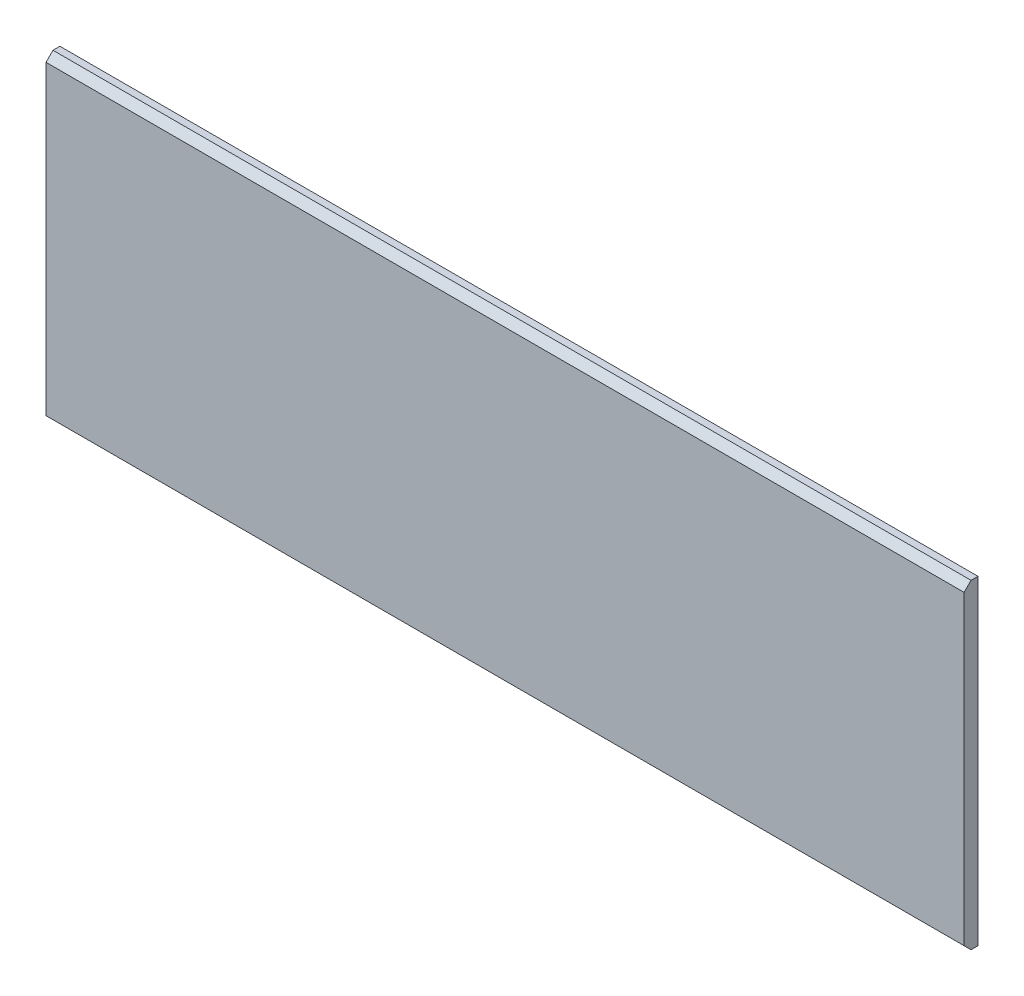
ISO-10303-21;
HEADER;
FILE_DESCRIPTION(('STEP AP214'),'2;1');
FILE_NAME('part.step','',(''),(''),'','','');
FILE_SCHEMA(('AUTOMOTIVE_DESIGN { 1 0 10303 214 1 1 1 1 }'));
ENDSEC;
DATA;
#1=APPLICATION_CONTEXT('core data for automotive mechanical design processes');
#2=APPLICATION_PROTOCOL_DEFINITION('international standard','automotive_design',2000,#1);
#3=PRODUCT_CONTEXT('',#1,'mechanical');
#4=PRODUCT('Part','Part','',(#3));
#5=PRODUCT_RELATED_PRODUCT_CATEGORY('part','',(#4));
#6=PRODUCT_DEFINITION_FORMATION('','',#4);
#7=PRODUCT_DEFINITION_CONTEXT('part definition',#1,'design');
#8=PRODUCT_DEFINITION('design','',#6,#7);
#9=PRODUCT_DEFINITION_SHAPE('','',#8);
#10=(LENGTH_UNIT() NAMED_UNIT(*) SI_UNIT(.MILLI.,.METRE.));
#11=(NAMED_UNIT(*) PLANE_ANGLE_UNIT() SI_UNIT($,.RADIAN.));
#12=(NAMED_UNIT(*) SI_UNIT($,.STERADIAN.) SOLID_ANGLE_UNIT());
#13=UNCERTAINTY_MEASURE_WITH_UNIT(LENGTH_MEASURE(1.E-05),#10,'distance_accuracy_value','');
#14=(GEOMETRIC_REPRESENTATION_CONTEXT(3) GLOBAL_UNCERTAINTY_ASSIGNED_CONTEXT((#13)) GLOBAL_UNIT_ASSIGNED_CONTEXT((#10,
#11,#12)) REPRESENTATION_CONTEXT('',''));
#15=CARTESIAN_POINT('',(0.,0.,0.));
#16=DIRECTION('',(0.,0.,1.));
#17=DIRECTION('',(1.,0.,0.));
#18=AXIS2_PLACEMENT_3D('',#15,#16,#17);
#19=CARTESIAN_POINT('',(330.,115.,10.));
#20=DIRECTION('',(-1.,0.,0.));
#21=DIRECTION('',(0.,0.,1.));
#22=AXIS2_PLACEMENT_3D('',#19,#20,#21);
#23=PLANE('',#22);
#24=DIRECTION('',(0.,0.,-1.));
#25=VECTOR('',#24,1.);
#26=CARTESIAN_POINT('',(330.,115.,10.));
#27=LINE('',#26,#25);
#28=CARTESIAN_POINT('',(330.,115.,5.));
#29=VERTEX_POINT('',#28);
#30=CARTESIAN_POINT('',(330.,115.,0.));
#31=VERTEX_POINT('',#30);
#32=EDGE_CURVE('E86',#29,#31,#27,.T.);
#33=ORIENTED_EDGE('',*,*,#32,.F.);
#34=DIRECTION('',(0.,-0.707106781186551,0.707106781186544));
#35=VECTOR('',#34,1.);
#36=CARTESIAN_POINT('',(330.,110.,10.));
#37=LINE('',#36,#35);
#38=CARTESIAN_POINT('',(330.,110.,10.));
#39=VERTEX_POINT('',#38);
#40=EDGE_CURVE('E43',#29,#39,#37,.T.);
#41=ORIENTED_EDGE('',*,*,#40,.T.);
#42=DIRECTION('',(0.,1.,0.));
#43=VECTOR('',#42,1.);
#44=CARTESIAN_POINT('',(330.,115.,10.));
#45=LINE('',#44,#43);
#46=CARTESIAN_POINT('',(330.,-110.,10.));
#47=VERTEX_POINT('',#46);
#48=EDGE_CURVE('E114',#47,#39,#45,.T.);
#49=ORIENTED_EDGE('',*,*,#48,.F.);
#50=DIRECTION('',(0.,-0.707106781186551,-0.707106781186544));
#51=VECTOR('',#50,1.);
#52=CARTESIAN_POINT('',(330.,-110.,10.));
#53=LINE('',#52,#51);
#54=CARTESIAN_POINT('',(330.,-115.,5.));
#55=VERTEX_POINT('',#54);
#56=EDGE_CURVE('E50',#47,#55,#53,.T.);
#57=ORIENTED_EDGE('',*,*,#56,.T.);
#58=DIRECTION('',(0.,0.,-1.));
#59=VECTOR('',#58,1.);
#60=CARTESIAN_POINT('',(330.,-115.,10.));
#61=LINE('',#60,#59);
#62=CARTESIAN_POINT('',(330.,-115.,0.));
#63=VERTEX_POINT('',#62);
#64=EDGE_CURVE('E104',#55,#63,#61,.T.);
#65=ORIENTED_EDGE('',*,*,#64,.T.);
#66=DIRECTION('',(0.,1.,0.));
#67=VECTOR('',#66,1.);
#68=CARTESIAN_POINT('',(330.,115.,0.));
#69=LINE('',#68,#67);
#70=EDGE_CURVE('E100',#63,#31,#69,.T.);
#71=ORIENTED_EDGE('',*,*,#70,.T.);
#72=EDGE_LOOP('',(#33,#41,#49,#57,#65,#71));
#73=FACE_BOUND('',#72,.T.);
#74=ADVANCED_FACE('F35',(#73),#23,.F.);
#75=CARTESIAN_POINT('',(-330.,115.,10.));
#76=DIRECTION('',(0.,-1.,0.));
#77=DIRECTION('',(0.,0.,-1.));
#78=AXIS2_PLACEMENT_3D('',#75,#76,#77);
#79=PLANE('',#78);
#80=DIRECTION('',(0.,0.,-1.));
#81=VECTOR('',#80,1.);
#82=CARTESIAN_POINT('',(-330.,115.,10.));
#83=LINE('',#82,#81);
#84=CARTESIAN_POINT('',(-330.,115.,5.));
#85=VERTEX_POINT('',#84);
#86=CARTESIAN_POINT('',(-330.,115.,0.));
#87=VERTEX_POINT('',#86);
#88=EDGE_CURVE('E94',#85,#87,#83,.T.);
#89=ORIENTED_EDGE('',*,*,#88,.F.);
#90=DIRECTION('',(1.,0.,0.));
#91=VECTOR('',#90,1.);
#92=CARTESIAN_POINT('',(330.,115.,5.));
#93=LINE('',#92,#91);
#94=EDGE_CURVE('E58',#85,#29,#93,.T.);
#95=ORIENTED_EDGE('',*,*,#94,.T.);
#96=ORIENTED_EDGE('',*,*,#32,.T.);
#97=DIRECTION('',(-1.,0.,0.));
#98=VECTOR('',#97,1.);
#99=CARTESIAN_POINT('',(-330.,115.,0.));
#100=LINE('',#99,#98);
#101=EDGE_CURVE('E89',#31,#87,#100,.T.);
#102=ORIENTED_EDGE('',*,*,#101,.T.);
#103=EDGE_LOOP('',(#89,#95,#96,#102));
#104=FACE_BOUND('',#103,.T.);
#105=ADVANCED_FACE('F88',(#104),#79,.F.);
#106=CARTESIAN_POINT('',(-330.,115.,10.));
#107=DIRECTION('',(1.,0.,0.));
#108=DIRECTION('',(0.,1.,0.));
#109=AXIS2_PLACEMENT_3D('',#106,#107,#108);
#110=PLANE('',#109);
#111=DIRECTION('',(0.,-1.,0.));
#112=VECTOR('',#111,1.);
#113=CARTESIAN_POINT('',(-330.,115.,10.));
#114=LINE('',#113,#112);
#115=CARTESIAN_POINT('',(-330.,110.,10.));
#116=VERTEX_POINT('',#115);
#117=CARTESIAN_POINT('',(-330.,-110.,10.));
#118=VERTEX_POINT('',#117);
#119=EDGE_CURVE('E108',#116,#118,#114,.T.);
#120=ORIENTED_EDGE('',*,*,#119,.F.);
#121=DIRECTION('',(0.,0.707106781186551,-0.707106781186544));
#122=VECTOR('',#121,1.);
#123=CARTESIAN_POINT('',(-330.,110.,10.0000000000001));
#124=LINE('',#123,#122);
#125=EDGE_CURVE('E126',#116,#85,#124,.T.);
#126=ORIENTED_EDGE('',*,*,#125,.T.);
#127=ORIENTED_EDGE('',*,*,#88,.T.);
#128=DIRECTION('',(0.,-1.,0.));
#129=VECTOR('',#128,1.);
#130=CARTESIAN_POINT('',(-330.,115.,0.));
#131=LINE('',#130,#129);
#132=CARTESIAN_POINT('',(-330.,-115.,0.));
#133=VERTEX_POINT('',#132);
#134=EDGE_CURVE('E102',#87,#133,#131,.T.);
#135=ORIENTED_EDGE('',*,*,#134,.T.);
#136=DIRECTION('',(0.,0.,-1.));
#137=VECTOR('',#136,1.);
#138=CARTESIAN_POINT('',(-330.,-115.,10.));
#139=LINE('',#138,#137);
#140=CARTESIAN_POINT('',(-330.,-115.,5.));
#141=VERTEX_POINT('',#140);
#142=EDGE_CURVE('E116',#141,#133,#139,.T.);
#143=ORIENTED_EDGE('',*,*,#142,.F.);
#144=DIRECTION('',(0.,0.707106781186551,0.707106781186544));
#145=VECTOR('',#144,1.);
#146=CARTESIAN_POINT('',(-330.,-110.,9.99999999999992));
#147=LINE('',#146,#145);
#148=EDGE_CURVE('E124',#141,#118,#147,.T.);
#149=ORIENTED_EDGE('',*,*,#148,.T.);
#150=EDGE_LOOP('',(#120,#126,#127,#135,#143,#149));
#151=FACE_BOUND('',#150,.T.);
#152=ADVANCED_FACE('F139',(#151),#110,.F.);
#153=CARTESIAN_POINT('',(-330.,-115.,10.));
#154=DIRECTION('',(0.,1.,0.));
#155=DIRECTION('',(0.,0.,1.));
#156=AXIS2_PLACEMENT_3D('',#153,#154,#155);
#157=PLANE('',#156);
#158=ORIENTED_EDGE('',*,*,#64,.F.);
#159=DIRECTION('',(-1.,0.,0.));
#160=VECTOR('',#159,1.);
#161=CARTESIAN_POINT('',(-330.,-115.,5.));
#162=LINE('',#161,#160);
#163=EDGE_CURVE('E11',#55,#141,#162,.T.);
#164=ORIENTED_EDGE('',*,*,#163,.T.);
#165=ORIENTED_EDGE('',*,*,#142,.T.);
#166=DIRECTION('',(1.,0.,0.));
#167=VECTOR('',#166,1.);
#168=CARTESIAN_POINT('',(-330.,-115.,0.));
#169=LINE('',#168,#167);
#170=EDGE_CURVE('E112',#133,#63,#169,.T.);
#171=ORIENTED_EDGE('',*,*,#170,.T.);
#172=EDGE_LOOP('',(#158,#164,#165,#171));
#173=FACE_BOUND('',#172,.T.);
#174=ADVANCED_FACE('F145',(#173),#157,.F.);
#175=CARTESIAN_POINT('',(0.,0.,10.));
#176=DIRECTION('',(0.,0.,1.));
#177=DIRECTION('',(1.,0.,0.));
#178=AXIS2_PLACEMENT_3D('',#175,#176,#177);
#179=PLANE('',#178);
#180=ORIENTED_EDGE('',*,*,#48,.T.);
#181=DIRECTION('',(-1.,0.,0.));
#182=VECTOR('',#181,1.);
#183=CARTESIAN_POINT('',(-330.,110.,10.));
#184=LINE('',#183,#182);
#185=EDGE_CURVE('E121',#39,#116,#184,.T.);
#186=ORIENTED_EDGE('',*,*,#185,.T.);
#187=ORIENTED_EDGE('',*,*,#119,.T.);
#188=DIRECTION('',(1.,0.,0.));
#189=VECTOR('',#188,1.);
#190=CARTESIAN_POINT('',(330.,-110.,10.));
#191=LINE('',#190,#189);
#192=EDGE_CURVE('E93',#118,#47,#191,.T.);
#193=ORIENTED_EDGE('',*,*,#192,.T.);
#194=EDGE_LOOP('',(#180,#186,#187,#193));
#195=FACE_BOUND('',#194,.T.);
#196=ADVANCED_FACE('F133',(#195),#179,.T.);
#197=CARTESIAN_POINT('',(0.,0.,0.));
#198=DIRECTION('',(0.,0.,1.));
#199=DIRECTION('',(1.,0.,0.));
#200=AXIS2_PLACEMENT_3D('',#197,#198,#199);
#201=PLANE('',#200);
#202=ORIENTED_EDGE('',*,*,#70,.F.);
#203=ORIENTED_EDGE('',*,*,#170,.F.);
#204=ORIENTED_EDGE('',*,*,#134,.F.);
#205=ORIENTED_EDGE('',*,*,#101,.F.);
#206=EDGE_LOOP('',(#202,#203,#204,#205));
#207=FACE_BOUND('',#206,.T.);
#208=ADVANCED_FACE('F98',(#207),#201,.F.);
#209=CARTESIAN_POINT('',(0.,110.,10.));
#210=DIRECTION('',(0.,0.707106781186543,0.707106781186551));
#211=DIRECTION('',(1.,0.,0.));
#212=AXIS2_PLACEMENT_3D('',#209,#210,#211);
#213=PLANE('',#212);
#214=ORIENTED_EDGE('',*,*,#40,.F.);
#215=ORIENTED_EDGE('',*,*,#94,.F.);
#216=ORIENTED_EDGE('',*,*,#125,.F.);
#217=ORIENTED_EDGE('',*,*,#185,.F.);
#218=EDGE_LOOP('',(#214,#215,#216,#217));
#219=FACE_BOUND('',#218,.T.);
#220=ADVANCED_FACE('F137',(#219),#213,.T.);
#221=CARTESIAN_POINT('',(0.,-110.,10.));
#222=DIRECTION('',(0.,-0.707106781186543,0.707106781186551));
#223=DIRECTION('',(-1.,0.,0.));
#224=AXIS2_PLACEMENT_3D('',#221,#222,#223);
#225=PLANE('',#224);
#226=ORIENTED_EDGE('',*,*,#148,.F.);
#227=ORIENTED_EDGE('',*,*,#163,.F.);
#228=ORIENTED_EDGE('',*,*,#56,.F.);
#229=ORIENTED_EDGE('',*,*,#192,.F.);
#230=EDGE_LOOP('',(#226,#227,#228,#229));
#231=FACE_BOUND('',#230,.T.);
#232=ADVANCED_FACE('F37',(#231),#225,.T.);
#233=CLOSED_SHELL('',(#74,#105,#152,#174,#196,#208,#220,#232));
#234=MANIFOLD_SOLID_BREP('B2',#233);
#235=ADVANCED_BREP_SHAPE_REPRESENTATION('',(#18,#234),#14);
#236=SHAPE_DEFINITION_REPRESENTATION(#9,#235);
ENDSEC;
END-ISO-10303-21;
